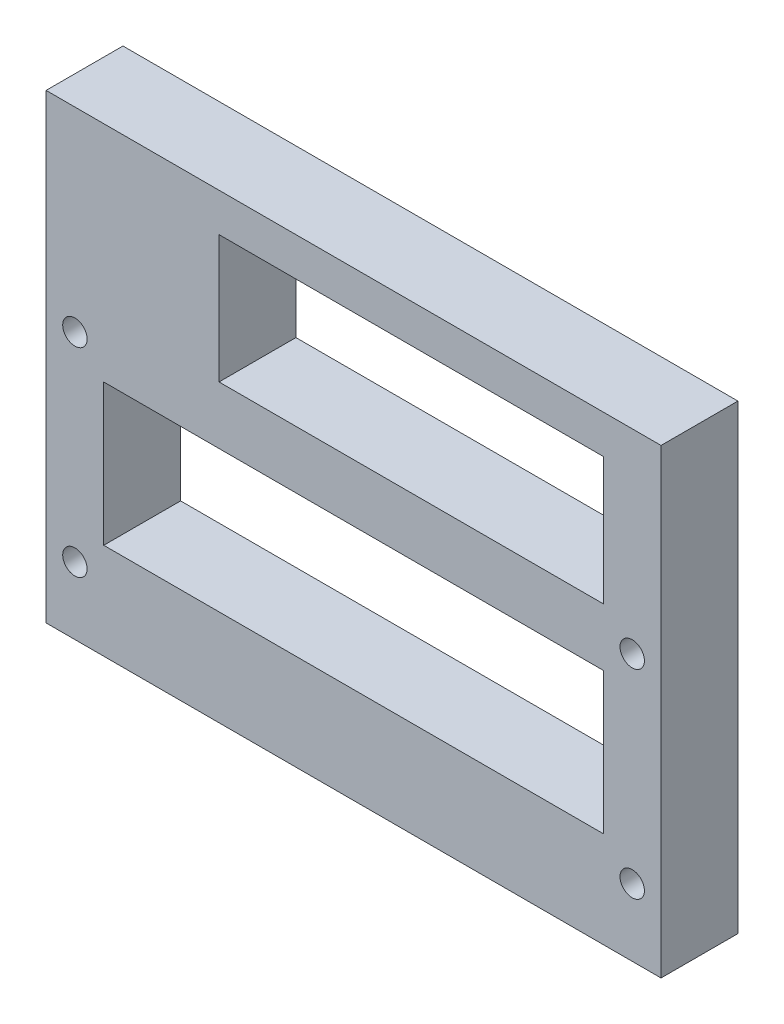
ISO-10303-21;
HEADER;
FILE_DESCRIPTION(('STEP AP214'),'2;1');
FILE_NAME('part.step','',(''),(''),'','','');
FILE_SCHEMA(('AUTOMOTIVE_DESIGN { 1 0 10303 214 1 1 1 1 }'));
ENDSEC;
DATA;
#1=APPLICATION_CONTEXT('core data for automotive mechanical design processes');
#2=APPLICATION_PROTOCOL_DEFINITION('international standard','automotive_design',2000,#1);
#3=PRODUCT_CONTEXT('',#1,'mechanical');
#4=PRODUCT('Part','Part','',(#3));
#5=PRODUCT_RELATED_PRODUCT_CATEGORY('part','',(#4));
#6=PRODUCT_DEFINITION_FORMATION('','',#4);
#7=PRODUCT_DEFINITION_CONTEXT('part definition',#1,'design');
#8=PRODUCT_DEFINITION('design','',#6,#7);
#9=PRODUCT_DEFINITION_SHAPE('','',#8);
#10=(LENGTH_UNIT() NAMED_UNIT(*) SI_UNIT(.MILLI.,.METRE.));
#11=(NAMED_UNIT(*) PLANE_ANGLE_UNIT() SI_UNIT($,.RADIAN.));
#12=(NAMED_UNIT(*) SI_UNIT($,.STERADIAN.) SOLID_ANGLE_UNIT());
#13=UNCERTAINTY_MEASURE_WITH_UNIT(LENGTH_MEASURE(1.E-05),#10,'distance_accuracy_value','');
#14=(GEOMETRIC_REPRESENTATION_CONTEXT(3) GLOBAL_UNCERTAINTY_ASSIGNED_CONTEXT((#13)) GLOBAL_UNIT_ASSIGNED_CONTEXT((#10,
#11,#12)) REPRESENTATION_CONTEXT('',''));
#15=CARTESIAN_POINT('',(0.,0.,0.));
#16=DIRECTION('',(0.,0.,1.));
#17=DIRECTION('',(1.,0.,0.));
#18=AXIS2_PLACEMENT_3D('',#15,#16,#17);
#19=CARTESIAN_POINT('',(72.5,0.,10.));
#20=DIRECTION('',(1.,0.,0.));
#21=DIRECTION('',(0.,0.,-1.));
#22=AXIS2_PLACEMENT_3D('',#19,#20,#21);
#23=PLANE('',#22);
#24=DIRECTION('',(0.,-1.,0.));
#25=VECTOR('',#24,1.);
#26=CARTESIAN_POINT('',(72.5,0.,0.));
#27=LINE('',#26,#25);
#28=CARTESIAN_POINT('',(72.5,47.5,0.));
#29=VERTEX_POINT('',#28);
#30=CARTESIAN_POINT('',(72.5,-12.5,0.));
#31=VERTEX_POINT('',#30);
#32=EDGE_CURVE('E196',#29,#31,#27,.T.);
#33=ORIENTED_EDGE('',*,*,#32,.F.);
#34=DIRECTION('',(0.,0.,-1.));
#35=VECTOR('',#34,1.);
#36=CARTESIAN_POINT('',(72.5,47.5,10.));
#37=LINE('',#36,#35);
#38=CARTESIAN_POINT('',(72.5,47.5,10.));
#39=VERTEX_POINT('',#38);
#40=EDGE_CURVE('E11',#39,#29,#37,.T.);
#41=ORIENTED_EDGE('',*,*,#40,.F.);
#42=DIRECTION('',(0.,-1.,0.));
#43=VECTOR('',#42,1.);
#44=CARTESIAN_POINT('',(72.5,0.,10.));
#45=LINE('',#44,#43);
#46=CARTESIAN_POINT('',(72.5,-12.5,10.));
#47=VERTEX_POINT('',#46);
#48=EDGE_CURVE('E152',#39,#47,#45,.T.);
#49=ORIENTED_EDGE('',*,*,#48,.T.);
#50=DIRECTION('',(0.,0.,-1.));
#51=VECTOR('',#50,1.);
#52=CARTESIAN_POINT('',(72.5,-12.5,10.));
#53=LINE('',#52,#51);
#54=EDGE_CURVE('E101',#47,#31,#53,.T.);
#55=ORIENTED_EDGE('',*,*,#54,.T.);
#56=EDGE_LOOP('',(#33,#41,#49,#55));
#57=FACE_BOUND('',#56,.T.);
#58=ADVANCED_FACE('F35',(#57),#23,.T.);
#59=CARTESIAN_POINT('',(0.,47.5,10.));
#60=DIRECTION('',(0.,1.,0.));
#61=DIRECTION('',(0.,0.,1.));
#62=AXIS2_PLACEMENT_3D('',#59,#60,#61);
#63=PLANE('',#62);
#64=DIRECTION('',(1.,0.,0.));
#65=VECTOR('',#64,1.);
#66=CARTESIAN_POINT('',(0.,47.5,0.));
#67=LINE('',#66,#65);
#68=CARTESIAN_POINT('',(-7.50000000000001,47.5,0.));
#69=VERTEX_POINT('',#68);
#70=EDGE_CURVE('E141',#69,#29,#67,.T.);
#71=ORIENTED_EDGE('',*,*,#70,.F.);
#72=DIRECTION('',(0.,0.,-1.));
#73=VECTOR('',#72,1.);
#74=CARTESIAN_POINT('',(-7.50000000000001,47.5,10.));
#75=LINE('',#74,#73);
#76=CARTESIAN_POINT('',(-7.50000000000001,47.5,10.));
#77=VERTEX_POINT('',#76);
#78=EDGE_CURVE('E45',#77,#69,#75,.T.);
#79=ORIENTED_EDGE('',*,*,#78,.F.);
#80=DIRECTION('',(1.,0.,0.));
#81=VECTOR('',#80,1.);
#82=CARTESIAN_POINT('',(0.,47.5,10.));
#83=LINE('',#82,#81);
#84=EDGE_CURVE('E139',#77,#39,#83,.T.);
#85=ORIENTED_EDGE('',*,*,#84,.T.);
#86=ORIENTED_EDGE('',*,*,#40,.T.);
#87=EDGE_LOOP('',(#71,#79,#85,#86));
#88=FACE_BOUND('',#87,.T.);
#89=ADVANCED_FACE('F137',(#88),#63,.T.);
#90=CARTESIAN_POINT('',(-7.50000000000001,0.,10.));
#91=DIRECTION('',(1.,0.,0.));
#92=DIRECTION('',(0.,0.,-1.));
#93=AXIS2_PLACEMENT_3D('',#90,#91,#92);
#94=PLANE('',#93);
#95=DIRECTION('',(0.,-1.,0.));
#96=VECTOR('',#95,1.);
#97=CARTESIAN_POINT('',(-7.50000000000001,0.,0.));
#98=LINE('',#97,#96);
#99=CARTESIAN_POINT('',(-7.50000000000001,-12.5,0.));
#100=VERTEX_POINT('',#99);
#101=EDGE_CURVE('E199',#69,#100,#98,.T.);
#102=ORIENTED_EDGE('',*,*,#101,.T.);
#103=DIRECTION('',(0.,0.,-1.));
#104=VECTOR('',#103,1.);
#105=CARTESIAN_POINT('',(-7.50000000000001,-12.5,10.));
#106=LINE('',#105,#104);
#107=CARTESIAN_POINT('',(-7.50000000000001,-12.5,10.));
#108=VERTEX_POINT('',#107);
#109=EDGE_CURVE('E144',#108,#100,#106,.T.);
#110=ORIENTED_EDGE('',*,*,#109,.F.);
#111=DIRECTION('',(0.,-1.,0.));
#112=VECTOR('',#111,1.);
#113=CARTESIAN_POINT('',(-7.50000000000001,0.,10.));
#114=LINE('',#113,#112);
#115=EDGE_CURVE('E147',#77,#108,#114,.T.);
#116=ORIENTED_EDGE('',*,*,#115,.F.);
#117=ORIENTED_EDGE('',*,*,#78,.T.);
#118=EDGE_LOOP('',(#102,#110,#116,#117));
#119=FACE_BOUND('',#118,.T.);
#120=ADVANCED_FACE('F148',(#119),#94,.F.);
#121=CARTESIAN_POINT('',(0.,0.,10.));
#122=DIRECTION('',(-1.,0.,0.));
#123=DIRECTION('',(0.,0.,1.));
#124=AXIS2_PLACEMENT_3D('',#121,#122,#123);
#125=PLANE('',#124);
#126=DIRECTION('',(0.,1.,0.));
#127=VECTOR('',#126,1.);
#128=CARTESIAN_POINT('',(0.,0.,0.));
#129=LINE('',#128,#127);
#130=CARTESIAN_POINT('',(0.,0.,0.));
#131=VERTEX_POINT('',#130);
#132=CARTESIAN_POINT('',(0.,18.4,0.));
#133=VERTEX_POINT('',#132);
#134=EDGE_CURVE('E181',#131,#133,#129,.T.);
#135=ORIENTED_EDGE('',*,*,#134,.T.);
#136=DIRECTION('',(0.,0.,-1.));
#137=VECTOR('',#136,1.);
#138=CARTESIAN_POINT('',(0.,18.4,10.));
#139=LINE('',#138,#137);
#140=CARTESIAN_POINT('',(0.,18.4,10.));
#141=VERTEX_POINT('',#140);
#142=EDGE_CURVE('E213',#141,#133,#139,.T.);
#143=ORIENTED_EDGE('',*,*,#142,.F.);
#144=DIRECTION('',(0.,1.,0.));
#145=VECTOR('',#144,1.);
#146=CARTESIAN_POINT('',(0.,0.,10.));
#147=LINE('',#146,#145);
#148=CARTESIAN_POINT('',(0.,0.,10.));
#149=VERTEX_POINT('',#148);
#150=EDGE_CURVE('E480',#149,#141,#147,.T.);
#151=ORIENTED_EDGE('',*,*,#150,.F.);
#152=DIRECTION('',(0.,0.,-1.));
#153=VECTOR('',#152,1.);
#154=CARTESIAN_POINT('',(0.,0.,10.));
#155=LINE('',#154,#153);
#156=EDGE_CURVE('E215',#149,#131,#155,.T.);
#157=ORIENTED_EDGE('',*,*,#156,.T.);
#158=EDGE_LOOP('',(#135,#143,#151,#157));
#159=FACE_BOUND('',#158,.T.);
#160=ADVANCED_FACE('F281',(#159),#125,.F.);
#161=CARTESIAN_POINT('',(0.,18.4,10.));
#162=DIRECTION('',(0.,1.,0.));
#163=DIRECTION('',(0.,0.,1.));
#164=AXIS2_PLACEMENT_3D('',#161,#162,#163);
#165=PLANE('',#164);
#166=DIRECTION('',(1.,0.,0.));
#167=VECTOR('',#166,1.);
#168=CARTESIAN_POINT('',(0.,18.4,0.));
#169=LINE('',#168,#167);
#170=CARTESIAN_POINT('',(65.,18.4,0.));
#171=VERTEX_POINT('',#170);
#172=EDGE_CURVE('E184',#133,#171,#169,.T.);
#173=ORIENTED_EDGE('',*,*,#172,.T.);
#174=DIRECTION('',(0.,0.,-1.));
#175=VECTOR('',#174,1.);
#176=CARTESIAN_POINT('',(65.,18.4,10.));
#177=LINE('',#176,#175);
#178=CARTESIAN_POINT('',(65.,18.4,10.));
#179=VERTEX_POINT('',#178);
#180=EDGE_CURVE('E219',#179,#171,#177,.T.);
#181=ORIENTED_EDGE('',*,*,#180,.F.);
#182=DIRECTION('',(1.,0.,0.));
#183=VECTOR('',#182,1.);
#184=CARTESIAN_POINT('',(0.,18.4,10.));
#185=LINE('',#184,#183);
#186=EDGE_CURVE('E491',#141,#179,#185,.T.);
#187=ORIENTED_EDGE('',*,*,#186,.F.);
#188=ORIENTED_EDGE('',*,*,#142,.T.);
#189=EDGE_LOOP('',(#173,#181,#187,#188));
#190=FACE_BOUND('',#189,.T.);
#191=ADVANCED_FACE('F277',(#190),#165,.F.);
#192=CARTESIAN_POINT('',(65.,0.,10.));
#193=DIRECTION('',(-1.,0.,0.));
#194=DIRECTION('',(0.,0.,1.));
#195=AXIS2_PLACEMENT_3D('',#192,#193,#194);
#196=PLANE('',#195);
#197=DIRECTION('',(0.,1.,0.));
#198=VECTOR('',#197,1.);
#199=CARTESIAN_POINT('',(65.,0.,0.));
#200=LINE('',#199,#198);
#201=CARTESIAN_POINT('',(65.,0.,0.));
#202=VERTEX_POINT('',#201);
#203=EDGE_CURVE('E187',#202,#171,#200,.T.);
#204=ORIENTED_EDGE('',*,*,#203,.F.);
#205=DIRECTION('',(0.,0.,-1.));
#206=VECTOR('',#205,1.);
#207=CARTESIAN_POINT('',(65.,0.,10.));
#208=LINE('',#207,#206);
#209=CARTESIAN_POINT('',(65.,0.,10.));
#210=VERTEX_POINT('',#209);
#211=EDGE_CURVE('E217',#210,#202,#208,.T.);
#212=ORIENTED_EDGE('',*,*,#211,.F.);
#213=DIRECTION('',(0.,1.,0.));
#214=VECTOR('',#213,1.);
#215=CARTESIAN_POINT('',(65.,0.,10.));
#216=LINE('',#215,#214);
#217=EDGE_CURVE('E486',#210,#179,#216,.T.);
#218=ORIENTED_EDGE('',*,*,#217,.T.);
#219=ORIENTED_EDGE('',*,*,#180,.T.);
#220=EDGE_LOOP('',(#204,#212,#218,#219));
#221=FACE_BOUND('',#220,.T.);
#222=ADVANCED_FACE('F274',(#221),#196,.T.);
#223=CARTESIAN_POINT('',(0.,42.5,10.));
#224=DIRECTION('',(0.,-1.,0.));
#225=DIRECTION('',(1.,0.,0.));
#226=AXIS2_PLACEMENT_3D('',#223,#224,#225);
#227=PLANE('',#226);
#228=DIRECTION('',(-1.,0.,0.));
#229=VECTOR('',#228,1.);
#230=CARTESIAN_POINT('',(0.,42.5,0.));
#231=LINE('',#230,#229);
#232=CARTESIAN_POINT('',(65.,42.5,0.));
#233=VERTEX_POINT('',#232);
#234=CARTESIAN_POINT('',(15.,42.5,0.));
#235=VERTEX_POINT('',#234);
#236=EDGE_CURVE('E169',#233,#235,#231,.T.);
#237=ORIENTED_EDGE('',*,*,#236,.F.);
#238=DIRECTION('',(0.,0.,-1.));
#239=VECTOR('',#238,1.);
#240=CARTESIAN_POINT('',(65.,42.5,10.));
#241=LINE('',#240,#239);
#242=CARTESIAN_POINT('',(65.,42.5,10.));
#243=VERTEX_POINT('',#242);
#244=EDGE_CURVE('E39',#243,#233,#241,.T.);
#245=ORIENTED_EDGE('',*,*,#244,.F.);
#246=DIRECTION('',(-1.,0.,0.));
#247=VECTOR('',#246,1.);
#248=CARTESIAN_POINT('',(0.,42.5,10.));
#249=LINE('',#248,#247);
#250=CARTESIAN_POINT('',(15.,42.5,10.));
#251=VERTEX_POINT('',#250);
#252=EDGE_CURVE('E211',#243,#251,#249,.T.);
#253=ORIENTED_EDGE('',*,*,#252,.T.);
#254=DIRECTION('',(0.,0.,-1.));
#255=VECTOR('',#254,1.);
#256=CARTESIAN_POINT('',(15.,42.5,10.));
#257=LINE('',#256,#255);
#258=EDGE_CURVE('E168',#251,#235,#257,.T.);
#259=ORIENTED_EDGE('',*,*,#258,.T.);
#260=EDGE_LOOP('',(#237,#245,#253,#259));
#261=FACE_BOUND('',#260,.T.);
#262=ADVANCED_FACE('F37',(#261),#227,.T.);
#263=CARTESIAN_POINT('',(65.,0.,10.));
#264=DIRECTION('',(1.,0.,0.));
#265=DIRECTION('',(0.,0.,-1.));
#266=AXIS2_PLACEMENT_3D('',#263,#264,#265);
#267=PLANE('',#266);
#268=DIRECTION('',(0.,-1.,0.));
#269=VECTOR('',#268,1.);
#270=CARTESIAN_POINT('',(65.,0.,0.));
#271=LINE('',#270,#269);
#272=CARTESIAN_POINT('',(65.,25.9,0.));
#273=VERTEX_POINT('',#272);
#274=EDGE_CURVE('E172',#233,#273,#271,.T.);
#275=ORIENTED_EDGE('',*,*,#274,.T.);
#276=DIRECTION('',(0.,0.,-1.));
#277=VECTOR('',#276,1.);
#278=CARTESIAN_POINT('',(65.,25.9,10.));
#279=LINE('',#278,#277);
#280=CARTESIAN_POINT('',(65.,25.9,10.));
#281=VERTEX_POINT('',#280);
#282=EDGE_CURVE('E225',#281,#273,#279,.T.);
#283=ORIENTED_EDGE('',*,*,#282,.F.);
#284=DIRECTION('',(0.,-1.,0.));
#285=VECTOR('',#284,1.);
#286=CARTESIAN_POINT('',(65.,0.,10.));
#287=LINE('',#286,#285);
#288=EDGE_CURVE('E233',#243,#281,#287,.T.);
#289=ORIENTED_EDGE('',*,*,#288,.F.);
#290=ORIENTED_EDGE('',*,*,#244,.T.);
#291=EDGE_LOOP('',(#275,#283,#289,#290));
#292=FACE_BOUND('',#291,.T.);
#293=ADVANCED_FACE('F232',(#292),#267,.F.);
#294=CARTESIAN_POINT('',(0.,25.9,10.));
#295=DIRECTION('',(0.,1.,0.));
#296=DIRECTION('',(0.,0.,1.));
#297=AXIS2_PLACEMENT_3D('',#294,#295,#296);
#298=PLANE('',#297);
#299=DIRECTION('',(1.,0.,0.));
#300=VECTOR('',#299,1.);
#301=CARTESIAN_POINT('',(0.,25.9,0.));
#302=LINE('',#301,#300);
#303=CARTESIAN_POINT('',(15.,25.9,0.));
#304=VERTEX_POINT('',#303);
#305=EDGE_CURVE('E175',#304,#273,#302,.T.);
#306=ORIENTED_EDGE('',*,*,#305,.F.);
#307=DIRECTION('',(0.,0.,-1.));
#308=VECTOR('',#307,1.);
#309=CARTESIAN_POINT('',(15.,25.9,10.));
#310=LINE('',#309,#308);
#311=CARTESIAN_POINT('',(15.,25.9,10.));
#312=VERTEX_POINT('',#311);
#313=EDGE_CURVE('E224',#312,#304,#310,.T.);
#314=ORIENTED_EDGE('',*,*,#313,.F.);
#315=DIRECTION('',(1.,0.,0.));
#316=VECTOR('',#315,1.);
#317=CARTESIAN_POINT('',(0.,25.9,10.));
#318=LINE('',#317,#316);
#319=EDGE_CURVE('E495',#312,#281,#318,.T.);
#320=ORIENTED_EDGE('',*,*,#319,.T.);
#321=ORIENTED_EDGE('',*,*,#282,.T.);
#322=EDGE_LOOP('',(#306,#314,#320,#321));
#323=FACE_BOUND('',#322,.T.);
#324=ADVANCED_FACE('F245',(#323),#298,.T.);
#325=CARTESIAN_POINT('',(68.75,-3.75,10.));
#326=DIRECTION('',(0.,0.,-1.));
#327=DIRECTION('',(-1.,0.,0.));
#328=AXIS2_PLACEMENT_3D('',#325,#326,#327);
#329=CYLINDRICAL_SURFACE('',#328,1.5875);
#330=CARTESIAN_POINT('',(68.75,-3.75,10.));
#331=DIRECTION('',(0.,0.,1.));
#332=DIRECTION('',(1.,0.,0.));
#333=AXIS2_PLACEMENT_3D('',#330,#331,#332);
#334=CIRCLE('',#333,1.5875);
#335=CARTESIAN_POINT('',(70.3375,-3.75,10.));
#336=VERTEX_POINT('',#335);
#337=EDGE_CURVE('E162',#336,#336,#334,.T.);
#338=ORIENTED_EDGE('',*,*,#337,.T.);
#339=EDGE_LOOP('',(#338));
#340=FACE_BOUND('',#339,.T.);
#341=CARTESIAN_POINT('',(68.75,-3.75,0.));
#342=DIRECTION('',(0.,0.,1.));
#343=DIRECTION('',(1.,0.,0.));
#344=AXIS2_PLACEMENT_3D('',#341,#342,#343);
#345=CIRCLE('',#344,1.5875);
#346=CARTESIAN_POINT('',(70.3375,-3.75,0.));
#347=VERTEX_POINT('',#346);
#348=EDGE_CURVE('E205',#347,#347,#345,.T.);
#349=ORIENTED_EDGE('',*,*,#348,.F.);
#350=EDGE_LOOP('',(#349));
#351=FACE_BOUND('',#350,.T.);
#352=ADVANCED_FACE('F247',(#340,#351),#329,.F.);
#353=CARTESIAN_POINT('',(68.75,22.15,10.));
#354=DIRECTION('',(0.,0.,-1.));
#355=DIRECTION('',(-1.,0.,0.));
#356=AXIS2_PLACEMENT_3D('',#353,#354,#355);
#357=CYLINDRICAL_SURFACE('',#356,1.5875);
#358=CARTESIAN_POINT('',(68.75,22.15,10.));
#359=DIRECTION('',(0.,0.,1.));
#360=DIRECTION('',(1.,0.,0.));
#361=AXIS2_PLACEMENT_3D('',#358,#359,#360);
#362=CIRCLE('',#361,1.5875);
#363=CARTESIAN_POINT('',(70.3375,22.15,10.));
#364=VERTEX_POINT('',#363);
#365=EDGE_CURVE('E159',#364,#364,#362,.T.);
#366=ORIENTED_EDGE('',*,*,#365,.T.);
#367=EDGE_LOOP('',(#366));
#368=FACE_BOUND('',#367,.T.);
#369=CARTESIAN_POINT('',(68.75,22.15,0.));
#370=DIRECTION('',(0.,0.,1.));
#371=DIRECTION('',(1.,0.,0.));
#372=AXIS2_PLACEMENT_3D('',#369,#370,#371);
#373=CIRCLE('',#372,1.5875);
#374=CARTESIAN_POINT('',(70.3375,22.15,0.));
#375=VERTEX_POINT('',#374);
#376=EDGE_CURVE('E202',#375,#375,#373,.T.);
#377=ORIENTED_EDGE('',*,*,#376,.F.);
#378=EDGE_LOOP('',(#377));
#379=FACE_BOUND('',#378,.T.);
#380=ADVANCED_FACE('F253',(#368,#379),#357,.F.);
#381=CARTESIAN_POINT('',(0.,-12.5,10.));
#382=DIRECTION('',(0.,1.,0.));
#383=DIRECTION('',(0.,0.,1.));
#384=AXIS2_PLACEMENT_3D('',#381,#382,#383);
#385=PLANE('',#384);
#386=DIRECTION('',(1.,0.,0.));
#387=VECTOR('',#386,1.);
#388=CARTESIAN_POINT('',(0.,-12.5,0.));
#389=LINE('',#388,#387);
#390=EDGE_CURVE('E94',#100,#31,#389,.T.);
#391=ORIENTED_EDGE('',*,*,#390,.T.);
#392=ORIENTED_EDGE('',*,*,#54,.F.);
#393=DIRECTION('',(1.,0.,0.));
#394=VECTOR('',#393,1.);
#395=CARTESIAN_POINT('',(0.,-12.5,10.));
#396=LINE('',#395,#394);
#397=EDGE_CURVE('E54',#108,#47,#396,.T.);
#398=ORIENTED_EDGE('',*,*,#397,.F.);
#399=ORIENTED_EDGE('',*,*,#109,.T.);
#400=EDGE_LOOP('',(#391,#392,#398,#399));
#401=FACE_BOUND('',#400,.T.);
#402=ADVANCED_FACE('F269',(#401),#385,.F.);
#403=CARTESIAN_POINT('',(-3.75,22.15,10.));
#404=DIRECTION('',(0.,0.,-1.));
#405=DIRECTION('',(-1.,0.,0.));
#406=AXIS2_PLACEMENT_3D('',#403,#404,#405);
#407=CYLINDRICAL_SURFACE('',#406,1.5875);
#408=CARTESIAN_POINT('',(-3.75,22.15,10.));
#409=DIRECTION('',(0.,0.,1.));
#410=DIRECTION('',(1.,0.,0.));
#411=AXIS2_PLACEMENT_3D('',#408,#409,#410);
#412=CIRCLE('',#411,1.5875);
#413=CARTESIAN_POINT('',(-2.1625,22.15,10.));
#414=VERTEX_POINT('',#413);
#415=EDGE_CURVE('E154',#414,#414,#412,.T.);
#416=ORIENTED_EDGE('',*,*,#415,.T.);
#417=EDGE_LOOP('',(#416));
#418=FACE_BOUND('',#417,.T.);
#419=CARTESIAN_POINT('',(-3.75,22.15,0.));
#420=DIRECTION('',(0.,0.,1.));
#421=DIRECTION('',(1.,0.,0.));
#422=AXIS2_PLACEMENT_3D('',#419,#420,#421);
#423=CIRCLE('',#422,1.5875);
#424=CARTESIAN_POINT('',(-2.1625,22.15,0.));
#425=VERTEX_POINT('',#424);
#426=EDGE_CURVE('E193',#425,#425,#423,.T.);
#427=ORIENTED_EDGE('',*,*,#426,.F.);
#428=EDGE_LOOP('',(#427));
#429=FACE_BOUND('',#428,.T.);
#430=ADVANCED_FACE('F265',(#418,#429),#407,.F.);
#431=CARTESIAN_POINT('',(0.,0.,10.));
#432=DIRECTION('',(0.,1.,0.));
#433=DIRECTION('',(0.,0.,1.));
#434=AXIS2_PLACEMENT_3D('',#431,#432,#433);
#435=PLANE('',#434);
#436=DIRECTION('',(1.,0.,0.));
#437=VECTOR('',#436,1.);
#438=CARTESIAN_POINT('',(0.,0.,0.));
#439=LINE('',#438,#437);
#440=EDGE_CURVE('E190',#131,#202,#439,.T.);
#441=ORIENTED_EDGE('',*,*,#440,.F.);
#442=ORIENTED_EDGE('',*,*,#156,.F.);
#443=DIRECTION('',(1.,0.,0.));
#444=VECTOR('',#443,1.);
#445=CARTESIAN_POINT('',(0.,0.,10.));
#446=LINE('',#445,#444);
#447=EDGE_CURVE('E484',#149,#210,#446,.T.);
#448=ORIENTED_EDGE('',*,*,#447,.T.);
#449=ORIENTED_EDGE('',*,*,#211,.T.);
#450=EDGE_LOOP('',(#441,#442,#448,#449));
#451=FACE_BOUND('',#450,.T.);
#452=ADVANCED_FACE('F268',(#451),#435,.T.);
#453=CARTESIAN_POINT('',(15.,0.,10.));
#454=DIRECTION('',(1.,0.,0.));
#455=DIRECTION('',(0.,1.,0.));
#456=AXIS2_PLACEMENT_3D('',#453,#454,#455);
#457=PLANE('',#456);
#458=DIRECTION('',(0.,-1.,0.));
#459=VECTOR('',#458,1.);
#460=CARTESIAN_POINT('',(15.,0.,0.));
#461=LINE('',#460,#459);
#462=EDGE_CURVE('E178',#235,#304,#461,.T.);
#463=ORIENTED_EDGE('',*,*,#462,.F.);
#464=ORIENTED_EDGE('',*,*,#258,.F.);
#465=DIRECTION('',(0.,-1.,0.));
#466=VECTOR('',#465,1.);
#467=CARTESIAN_POINT('',(15.,0.,10.));
#468=LINE('',#467,#466);
#469=EDGE_CURVE('E243',#251,#312,#468,.T.);
#470=ORIENTED_EDGE('',*,*,#469,.T.);
#471=ORIENTED_EDGE('',*,*,#313,.T.);
#472=EDGE_LOOP('',(#463,#464,#470,#471));
#473=FACE_BOUND('',#472,.T.);
#474=ADVANCED_FACE('F242',(#473),#457,.T.);
#475=CARTESIAN_POINT('',(-3.75,-3.75,10.));
#476=DIRECTION('',(0.,0.,-1.));
#477=DIRECTION('',(-1.,0.,0.));
#478=AXIS2_PLACEMENT_3D('',#475,#476,#477);
#479=CYLINDRICAL_SURFACE('',#478,1.5875);
#480=CARTESIAN_POINT('',(-3.75,-3.75,10.));
#481=DIRECTION('',(0.,0.,1.));
#482=DIRECTION('',(1.,0.,0.));
#483=AXIS2_PLACEMENT_3D('',#480,#481,#482);
#484=CIRCLE('',#483,1.5875);
#485=CARTESIAN_POINT('',(-2.1625,-3.75,10.));
#486=VERTEX_POINT('',#485);
#487=EDGE_CURVE('E165',#486,#486,#484,.T.);
#488=ORIENTED_EDGE('',*,*,#487,.T.);
#489=EDGE_LOOP('',(#488));
#490=FACE_BOUND('',#489,.T.);
#491=CARTESIAN_POINT('',(-3.75,-3.75,0.));
#492=DIRECTION('',(0.,0.,1.));
#493=DIRECTION('',(1.,0.,0.));
#494=AXIS2_PLACEMENT_3D('',#491,#492,#493);
#495=CIRCLE('',#494,1.5875);
#496=CARTESIAN_POINT('',(-2.1625,-3.75,0.));
#497=VERTEX_POINT('',#496);
#498=EDGE_CURVE('E208',#497,#497,#495,.T.);
#499=ORIENTED_EDGE('',*,*,#498,.F.);
#500=EDGE_LOOP('',(#499));
#501=FACE_BOUND('',#500,.T.);
#502=ADVANCED_FACE('F286',(#490,#501),#479,.F.);
#503=CARTESIAN_POINT('',(0.,0.,10.));
#504=DIRECTION('',(0.,0.,1.));
#505=DIRECTION('',(1.,0.,0.));
#506=AXIS2_PLACEMENT_3D('',#503,#504,#505);
#507=PLANE('',#506);
#508=ORIENTED_EDGE('',*,*,#252,.F.);
#509=ORIENTED_EDGE('',*,*,#288,.T.);
#510=ORIENTED_EDGE('',*,*,#319,.F.);
#511=ORIENTED_EDGE('',*,*,#469,.F.);
#512=EDGE_LOOP('',(#508,#509,#510,#511));
#513=FACE_BOUND('',#512,.T.);
#514=ORIENTED_EDGE('',*,*,#150,.T.);
#515=ORIENTED_EDGE('',*,*,#186,.T.);
#516=ORIENTED_EDGE('',*,*,#217,.F.);
#517=ORIENTED_EDGE('',*,*,#447,.F.);
#518=EDGE_LOOP('',(#514,#515,#516,#517));
#519=FACE_BOUND('',#518,.T.);
#520=ORIENTED_EDGE('',*,*,#415,.F.);
#521=EDGE_LOOP('',(#520));
#522=FACE_BOUND('',#521,.T.);
#523=ORIENTED_EDGE('',*,*,#48,.F.);
#524=ORIENTED_EDGE('',*,*,#84,.F.);
#525=ORIENTED_EDGE('',*,*,#115,.T.);
#526=ORIENTED_EDGE('',*,*,#397,.T.);
#527=EDGE_LOOP('',(#523,#524,#525,#526));
#528=FACE_BOUND('',#527,.T.);
#529=ORIENTED_EDGE('',*,*,#365,.F.);
#530=EDGE_LOOP('',(#529));
#531=FACE_BOUND('',#530,.T.);
#532=ORIENTED_EDGE('',*,*,#337,.F.);
#533=EDGE_LOOP('',(#532));
#534=FACE_BOUND('',#533,.T.);
#535=ORIENTED_EDGE('',*,*,#487,.F.);
#536=EDGE_LOOP('',(#535));
#537=FACE_BOUND('',#536,.T.);
#538=ADVANCED_FACE('F150',(#513,#519,#522,#528,#531,#534,#537),#507,.T.);
#539=CARTESIAN_POINT('',(0.,0.,0.));
#540=DIRECTION('',(0.,0.,1.));
#541=DIRECTION('',(1.,0.,0.));
#542=AXIS2_PLACEMENT_3D('',#539,#540,#541);
#543=PLANE('',#542);
#544=ORIENTED_EDGE('',*,*,#236,.T.);
#545=ORIENTED_EDGE('',*,*,#462,.T.);
#546=ORIENTED_EDGE('',*,*,#305,.T.);
#547=ORIENTED_EDGE('',*,*,#274,.F.);
#548=EDGE_LOOP('',(#544,#545,#546,#547));
#549=FACE_BOUND('',#548,.T.);
#550=ORIENTED_EDGE('',*,*,#134,.F.);
#551=ORIENTED_EDGE('',*,*,#440,.T.);
#552=ORIENTED_EDGE('',*,*,#203,.T.);
#553=ORIENTED_EDGE('',*,*,#172,.F.);
#554=EDGE_LOOP('',(#550,#551,#552,#553));
#555=FACE_BOUND('',#554,.T.);
#556=ORIENTED_EDGE('',*,*,#426,.T.);
#557=EDGE_LOOP('',(#556));
#558=FACE_BOUND('',#557,.T.);
#559=ORIENTED_EDGE('',*,*,#32,.T.);
#560=ORIENTED_EDGE('',*,*,#390,.F.);
#561=ORIENTED_EDGE('',*,*,#101,.F.);
#562=ORIENTED_EDGE('',*,*,#70,.T.);
#563=EDGE_LOOP('',(#559,#560,#561,#562));
#564=FACE_BOUND('',#563,.T.);
#565=ORIENTED_EDGE('',*,*,#376,.T.);
#566=EDGE_LOOP('',(#565));
#567=FACE_BOUND('',#566,.T.);
#568=ORIENTED_EDGE('',*,*,#348,.T.);
#569=EDGE_LOOP('',(#568));
#570=FACE_BOUND('',#569,.T.);
#571=ORIENTED_EDGE('',*,*,#498,.T.);
#572=EDGE_LOOP('',(#571));
#573=FACE_BOUND('',#572,.T.);
#574=ADVANCED_FACE('F236',(#549,#555,#558,#564,#567,#570,#573),#543,.F.);
#575=CLOSED_SHELL('',(#58,#89,#120,#160,#191,#222,#262,#293,#324,#352,#380,#402,#430,#452,#474,
#502,#538,#574));
#576=MANIFOLD_SOLID_BREP('B2',#575);
#577=ADVANCED_BREP_SHAPE_REPRESENTATION('',(#18,#576),#14);
#578=SHAPE_DEFINITION_REPRESENTATION(#9,#577);
ENDSEC;
END-ISO-10303-21;
